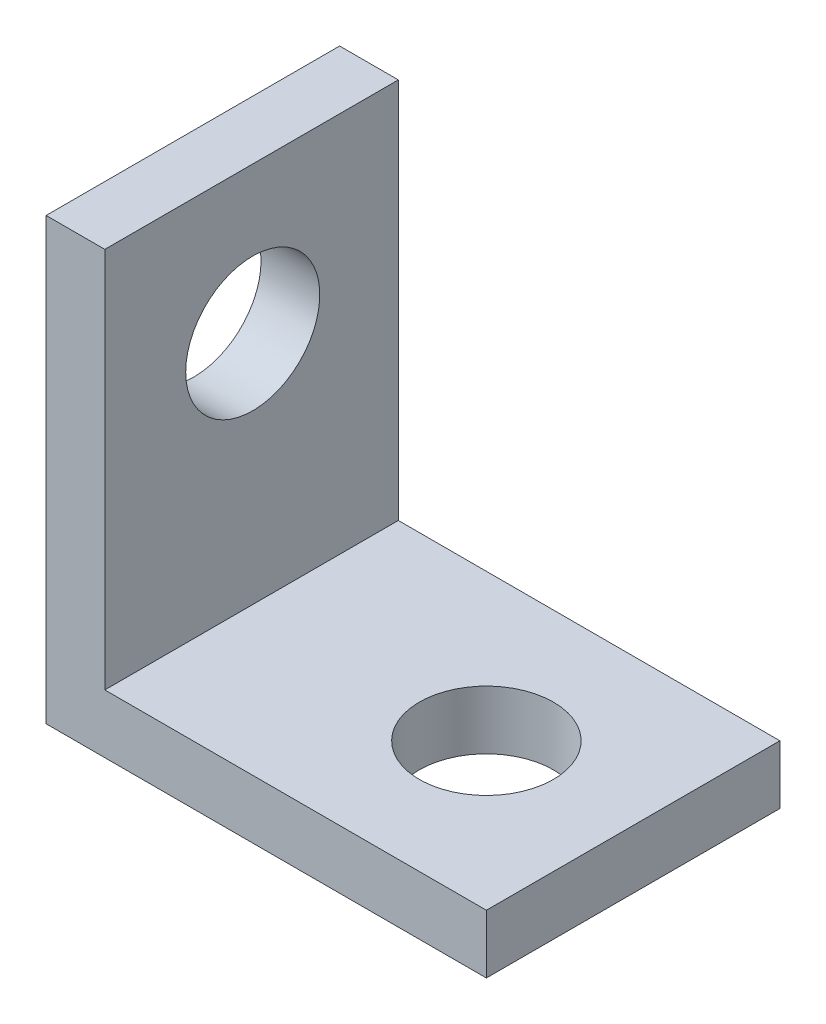
ISO-10303-21;
HEADER;
FILE_DESCRIPTION(('STEP AP214'),'2;1');
FILE_NAME('part.step','',(''),(''),'','','');
FILE_SCHEMA(('AUTOMOTIVE_DESIGN { 1 0 10303 214 1 1 1 1 }'));
ENDSEC;
DATA;
#1=APPLICATION_CONTEXT('core data for automotive mechanical design processes');
#2=APPLICATION_PROTOCOL_DEFINITION('international standard','automotive_design',2000,#1);
#3=PRODUCT_CONTEXT('',#1,'mechanical');
#4=PRODUCT('Part','Part','',(#3));
#5=PRODUCT_RELATED_PRODUCT_CATEGORY('part','',(#4));
#6=PRODUCT_DEFINITION_FORMATION('','',#4);
#7=PRODUCT_DEFINITION_CONTEXT('part definition',#1,'design');
#8=PRODUCT_DEFINITION('design','',#6,#7);
#9=PRODUCT_DEFINITION_SHAPE('','',#8);
#10=(LENGTH_UNIT() NAMED_UNIT(*) SI_UNIT(.MILLI.,.METRE.));
#11=(NAMED_UNIT(*) PLANE_ANGLE_UNIT() SI_UNIT($,.RADIAN.));
#12=(NAMED_UNIT(*) SI_UNIT($,.STERADIAN.) SOLID_ANGLE_UNIT());
#13=UNCERTAINTY_MEASURE_WITH_UNIT(LENGTH_MEASURE(1.E-05),#10,'distance_accuracy_value','');
#14=(GEOMETRIC_REPRESENTATION_CONTEXT(3) GLOBAL_UNCERTAINTY_ASSIGNED_CONTEXT((#13)) GLOBAL_UNIT_ASSIGNED_CONTEXT((#10,
#11,#12)) REPRESENTATION_CONTEXT('',''));
#15=CARTESIAN_POINT('',(0.,0.,0.));
#16=DIRECTION('',(0.,0.,1.));
#17=DIRECTION('',(1.,0.,0.));
#18=AXIS2_PLACEMENT_3D('',#15,#16,#17);
#19=CARTESIAN_POINT('',(0.,0.,12.7));
#20=DIRECTION('',(0.,1.,0.));
#21=DIRECTION('',(0.,0.,1.));
#22=AXIS2_PLACEMENT_3D('',#19,#20,#21);
#23=PLANE('',#22);
#24=CARTESIAN_POINT('',(12.7,0.,6.35));
#25=DIRECTION('',(0.,1.,0.));
#26=DIRECTION('',(0.,0.,1.));
#27=AXIS2_PLACEMENT_3D('',#24,#25,#26);
#28=CIRCLE('',#27,2.9);
#29=CARTESIAN_POINT('',(12.7,0.,9.25));
#30=VERTEX_POINT('',#29);
#31=EDGE_CURVE('E184',#30,#30,#28,.T.);
#32=ORIENTED_EDGE('',*,*,#31,.T.);
#33=EDGE_LOOP('',(#32));
#34=FACE_BOUND('',#33,.T.);
#35=DIRECTION('',(1.,0.,0.));
#36=VECTOR('',#35,1.);
#37=CARTESIAN_POINT('',(0.,0.,0.));
#38=LINE('',#37,#36);
#39=CARTESIAN_POINT('',(0.,0.,0.));
#40=VERTEX_POINT('',#39);
#41=CARTESIAN_POINT('',(19.05,0.,0.));
#42=VERTEX_POINT('',#41);
#43=EDGE_CURVE('E129',#40,#42,#38,.T.);
#44=ORIENTED_EDGE('',*,*,#43,.T.);
#45=DIRECTION('',(0.,0.,-1.));
#46=VECTOR('',#45,1.);
#47=CARTESIAN_POINT('',(19.05,0.,12.7));
#48=LINE('',#47,#46);
#49=CARTESIAN_POINT('',(19.05,0.,12.7));
#50=VERTEX_POINT('',#49);
#51=EDGE_CURVE('E11',#50,#42,#48,.T.);
#52=ORIENTED_EDGE('',*,*,#51,.F.);
#53=DIRECTION('',(1.,0.,0.));
#54=VECTOR('',#53,1.);
#55=CARTESIAN_POINT('',(0.,0.,12.7));
#56=LINE('',#55,#54);
#57=CARTESIAN_POINT('',(0.,0.,12.7));
#58=VERTEX_POINT('',#57);
#59=EDGE_CURVE('E146',#58,#50,#56,.T.);
#60=ORIENTED_EDGE('',*,*,#59,.F.);
#61=DIRECTION('',(0.,0.,-1.));
#62=VECTOR('',#61,1.);
#63=CARTESIAN_POINT('',(0.,0.,12.7));
#64=LINE('',#63,#62);
#65=EDGE_CURVE('E125',#58,#40,#64,.T.);
#66=ORIENTED_EDGE('',*,*,#65,.T.);
#67=EDGE_LOOP('',(#44,#52,#60,#66));
#68=FACE_BOUND('',#67,.T.);
#69=ADVANCED_FACE('F39',(#34,#68),#23,.F.);
#70=CARTESIAN_POINT('',(19.05,0.,12.7));
#71=DIRECTION('',(-1.,0.,0.));
#72=DIRECTION('',(0.,0.,1.));
#73=AXIS2_PLACEMENT_3D('',#70,#71,#72);
#74=PLANE('',#73);
#75=DIRECTION('',(0.,1.,0.));
#76=VECTOR('',#75,1.);
#77=CARTESIAN_POINT('',(19.05,0.,0.));
#78=LINE('',#77,#76);
#79=CARTESIAN_POINT('',(19.05,2.54,0.));
#80=VERTEX_POINT('',#79);
#81=EDGE_CURVE('E133',#42,#80,#78,.T.);
#82=ORIENTED_EDGE('',*,*,#81,.T.);
#83=DIRECTION('',(0.,0.,-1.));
#84=VECTOR('',#83,1.);
#85=CARTESIAN_POINT('',(19.05,2.54,12.7));
#86=LINE('',#85,#84);
#87=CARTESIAN_POINT('',(19.05,2.54,12.7));
#88=VERTEX_POINT('',#87);
#89=EDGE_CURVE('E49',#88,#80,#86,.T.);
#90=ORIENTED_EDGE('',*,*,#89,.F.);
#91=DIRECTION('',(0.,1.,0.));
#92=VECTOR('',#91,1.);
#93=CARTESIAN_POINT('',(19.05,0.,12.7));
#94=LINE('',#93,#92);
#95=EDGE_CURVE('E94',#50,#88,#94,.T.);
#96=ORIENTED_EDGE('',*,*,#95,.F.);
#97=ORIENTED_EDGE('',*,*,#51,.T.);
#98=EDGE_LOOP('',(#82,#90,#96,#97));
#99=FACE_BOUND('',#98,.T.);
#100=ADVANCED_FACE('F177',(#99),#74,.F.);
#101=CARTESIAN_POINT('',(2.54,2.54,12.7));
#102=DIRECTION('',(0.,-1.,0.));
#103=DIRECTION('',(0.,0.,-1.));
#104=AXIS2_PLACEMENT_3D('',#101,#102,#103);
#105=PLANE('',#104);
#106=CARTESIAN_POINT('',(12.7,2.54,6.35));
#107=DIRECTION('',(0.,-1.,0.));
#108=DIRECTION('',(0.,0.,-1.));
#109=AXIS2_PLACEMENT_3D('',#106,#107,#108);
#110=CIRCLE('',#109,2.9);
#111=CARTESIAN_POINT('',(12.7,2.54,3.45));
#112=VERTEX_POINT('',#111);
#113=EDGE_CURVE('E42',#112,#112,#110,.F.);
#114=ORIENTED_EDGE('',*,*,#113,.F.);
#115=EDGE_LOOP('',(#114));
#116=FACE_BOUND('',#115,.T.);
#117=DIRECTION('',(-1.,0.,0.));
#118=VECTOR('',#117,1.);
#119=CARTESIAN_POINT('',(2.54,2.54,0.));
#120=LINE('',#119,#118);
#121=CARTESIAN_POINT('',(2.54,2.54,0.));
#122=VERTEX_POINT('',#121);
#123=EDGE_CURVE('E137',#80,#122,#120,.T.);
#124=ORIENTED_EDGE('',*,*,#123,.T.);
#125=DIRECTION('',(0.,0.,-1.));
#126=VECTOR('',#125,1.);
#127=CARTESIAN_POINT('',(2.54,2.54,12.7));
#128=LINE('',#127,#126);
#129=CARTESIAN_POINT('',(2.54,2.54,12.7));
#130=VERTEX_POINT('',#129);
#131=EDGE_CURVE('E118',#130,#122,#128,.T.);
#132=ORIENTED_EDGE('',*,*,#131,.F.);
#133=DIRECTION('',(-1.,0.,0.));
#134=VECTOR('',#133,1.);
#135=CARTESIAN_POINT('',(2.54,2.54,12.7));
#136=LINE('',#135,#134);
#137=EDGE_CURVE('E107',#88,#130,#136,.T.);
#138=ORIENTED_EDGE('',*,*,#137,.F.);
#139=ORIENTED_EDGE('',*,*,#89,.T.);
#140=EDGE_LOOP('',(#124,#132,#138,#139));
#141=FACE_BOUND('',#140,.T.);
#142=ADVANCED_FACE('F157',(#116,#141),#105,.F.);
#143=CARTESIAN_POINT('',(2.54,2.54,12.7));
#144=DIRECTION('',(-1.,0.,0.));
#145=DIRECTION('',(0.,0.,1.));
#146=AXIS2_PLACEMENT_3D('',#143,#144,#145);
#147=PLANE('',#146);
#148=CARTESIAN_POINT('',(2.54,12.7,6.29990998680423));
#149=DIRECTION('',(-1.,0.,0.));
#150=DIRECTION('',(0.,0.,1.));
#151=AXIS2_PLACEMENT_3D('',#148,#149,#150);
#152=CIRCLE('',#151,2.9);
#153=CARTESIAN_POINT('',(2.54,12.7,9.19990998680422));
#154=VERTEX_POINT('',#153);
#155=EDGE_CURVE('E134',#154,#154,#152,.F.);
#156=ORIENTED_EDGE('',*,*,#155,.F.);
#157=EDGE_LOOP('',(#156));
#158=FACE_BOUND('',#157,.T.);
#159=DIRECTION('',(0.,1.,0.));
#160=VECTOR('',#159,1.);
#161=CARTESIAN_POINT('',(2.54,2.54,0.));
#162=LINE('',#161,#160);
#163=CARTESIAN_POINT('',(2.54,19.05,0.));
#164=VERTEX_POINT('',#163);
#165=EDGE_CURVE('E116',#122,#164,#162,.T.);
#166=ORIENTED_EDGE('',*,*,#165,.T.);
#167=DIRECTION('',(0.,0.,-1.));
#168=VECTOR('',#167,1.);
#169=CARTESIAN_POINT('',(2.54,19.05,12.7));
#170=LINE('',#169,#168);
#171=CARTESIAN_POINT('',(2.54,19.05,12.7));
#172=VERTEX_POINT('',#171);
#173=EDGE_CURVE('E113',#172,#164,#170,.T.);
#174=ORIENTED_EDGE('',*,*,#173,.F.);
#175=DIRECTION('',(0.,1.,0.));
#176=VECTOR('',#175,1.);
#177=CARTESIAN_POINT('',(2.54,2.54,12.7));
#178=LINE('',#177,#176);
#179=EDGE_CURVE('E101',#130,#172,#178,.T.);
#180=ORIENTED_EDGE('',*,*,#179,.F.);
#181=ORIENTED_EDGE('',*,*,#131,.T.);
#182=EDGE_LOOP('',(#166,#174,#180,#181));
#183=FACE_BOUND('',#182,.T.);
#184=ADVANCED_FACE('F114',(#158,#183),#147,.F.);
#185=CARTESIAN_POINT('',(0.,19.05,12.7));
#186=DIRECTION('',(0.,-1.,0.));
#187=DIRECTION('',(0.,0.,-1.));
#188=AXIS2_PLACEMENT_3D('',#185,#186,#187);
#189=PLANE('',#188);
#190=DIRECTION('',(-1.,0.,0.));
#191=VECTOR('',#190,1.);
#192=CARTESIAN_POINT('',(0.,19.05,0.));
#193=LINE('',#192,#191);
#194=CARTESIAN_POINT('',(0.,19.05,0.));
#195=VERTEX_POINT('',#194);
#196=EDGE_CURVE('E80',#164,#195,#193,.T.);
#197=ORIENTED_EDGE('',*,*,#196,.T.);
#198=DIRECTION('',(0.,0.,-1.));
#199=VECTOR('',#198,1.);
#200=CARTESIAN_POINT('',(0.,19.05,12.7));
#201=LINE('',#200,#199);
#202=CARTESIAN_POINT('',(0.,19.05,12.7));
#203=VERTEX_POINT('',#202);
#204=EDGE_CURVE('E119',#203,#195,#201,.T.);
#205=ORIENTED_EDGE('',*,*,#204,.F.);
#206=DIRECTION('',(-1.,0.,0.));
#207=VECTOR('',#206,1.);
#208=CARTESIAN_POINT('',(0.,19.05,12.7));
#209=LINE('',#208,#207);
#210=EDGE_CURVE('E105',#172,#203,#209,.T.);
#211=ORIENTED_EDGE('',*,*,#210,.F.);
#212=ORIENTED_EDGE('',*,*,#173,.T.);
#213=EDGE_LOOP('',(#197,#205,#211,#212));
#214=FACE_BOUND('',#213,.T.);
#215=ADVANCED_FACE('F121',(#214),#189,.F.);
#216=CARTESIAN_POINT('',(0.,0.,12.7));
#217=DIRECTION('',(1.,0.,0.));
#218=DIRECTION('',(0.,0.,-1.));
#219=AXIS2_PLACEMENT_3D('',#216,#217,#218);
#220=PLANE('',#219);
#221=CARTESIAN_POINT('',(0.,12.7,6.29990998680423));
#222=DIRECTION('',(1.,0.,0.));
#223=DIRECTION('',(0.,0.,-1.));
#224=AXIS2_PLACEMENT_3D('',#221,#222,#223);
#225=CIRCLE('',#224,2.9);
#226=CARTESIAN_POINT('',(0.,12.7,3.39990998680423));
#227=VERTEX_POINT('',#226);
#228=EDGE_CURVE('E190',#227,#227,#225,.T.);
#229=ORIENTED_EDGE('',*,*,#228,.T.);
#230=EDGE_LOOP('',(#229));
#231=FACE_BOUND('',#230,.T.);
#232=DIRECTION('',(0.,-1.,0.));
#233=VECTOR('',#232,1.);
#234=CARTESIAN_POINT('',(0.,0.,0.));
#235=LINE('',#234,#233);
#236=EDGE_CURVE('E86',#195,#40,#235,.T.);
#237=ORIENTED_EDGE('',*,*,#236,.T.);
#238=ORIENTED_EDGE('',*,*,#65,.F.);
#239=DIRECTION('',(0.,-1.,0.));
#240=VECTOR('',#239,1.);
#241=CARTESIAN_POINT('',(0.,0.,12.7));
#242=LINE('',#241,#240);
#243=EDGE_CURVE('E57',#203,#58,#242,.T.);
#244=ORIENTED_EDGE('',*,*,#243,.F.);
#245=ORIENTED_EDGE('',*,*,#204,.T.);
#246=EDGE_LOOP('',(#237,#238,#244,#245));
#247=FACE_BOUND('',#246,.T.);
#248=ADVANCED_FACE('F164',(#231,#247),#220,.F.);
#249=CARTESIAN_POINT('',(0.,0.,12.7));
#250=DIRECTION('',(0.,0.,1.));
#251=DIRECTION('',(1.,0.,0.));
#252=AXIS2_PLACEMENT_3D('',#249,#250,#251);
#253=PLANE('',#252);
#254=ORIENTED_EDGE('',*,*,#59,.T.);
#255=ORIENTED_EDGE('',*,*,#95,.T.);
#256=ORIENTED_EDGE('',*,*,#137,.T.);
#257=ORIENTED_EDGE('',*,*,#179,.T.);
#258=ORIENTED_EDGE('',*,*,#210,.T.);
#259=ORIENTED_EDGE('',*,*,#243,.T.);
#260=EDGE_LOOP('',(#254,#255,#256,#257,#258,#259));
#261=FACE_BOUND('',#260,.T.);
#262=ADVANCED_FACE('F103',(#261),#253,.T.);
#263=CARTESIAN_POINT('',(0.,0.,0.));
#264=DIRECTION('',(0.,0.,1.));
#265=DIRECTION('',(1.,0.,0.));
#266=AXIS2_PLACEMENT_3D('',#263,#264,#265);
#267=PLANE('',#266);
#268=ORIENTED_EDGE('',*,*,#43,.F.);
#269=ORIENTED_EDGE('',*,*,#236,.F.);
#270=ORIENTED_EDGE('',*,*,#196,.F.);
#271=ORIENTED_EDGE('',*,*,#165,.F.);
#272=ORIENTED_EDGE('',*,*,#123,.F.);
#273=ORIENTED_EDGE('',*,*,#81,.F.);
#274=EDGE_LOOP('',(#268,#269,#270,#271,#272,#273));
#275=FACE_BOUND('',#274,.T.);
#276=ADVANCED_FACE('F160',(#275),#267,.F.);
#277=CARTESIAN_POINT('',(12.7,12.7,6.29990998680423));
#278=DIRECTION('',(-1.,0.,0.));
#279=DIRECTION('',(0.,0.,1.));
#280=AXIS2_PLACEMENT_3D('',#277,#278,#279);
#281=CYLINDRICAL_SURFACE('',#280,2.9);
#282=ORIENTED_EDGE('',*,*,#228,.F.);
#283=EDGE_LOOP('',(#282));
#284=FACE_BOUND('',#283,.T.);
#285=ORIENTED_EDGE('',*,*,#155,.T.);
#286=EDGE_LOOP('',(#285));
#287=FACE_BOUND('',#286,.T.);
#288=ADVANCED_FACE('F203',(#284,#287),#281,.F.);
#289=CARTESIAN_POINT('',(12.7,12.7,6.35));
#290=DIRECTION('',(0.,-1.,0.));
#291=DIRECTION('',(0.,0.,-1.));
#292=AXIS2_PLACEMENT_3D('',#289,#290,#291);
#293=CYLINDRICAL_SURFACE('',#292,2.9);
#294=ORIENTED_EDGE('',*,*,#31,.F.);
#295=EDGE_LOOP('',(#294));
#296=FACE_BOUND('',#295,.T.);
#297=ORIENTED_EDGE('',*,*,#113,.T.);
#298=EDGE_LOOP('',(#297));
#299=FACE_BOUND('',#298,.T.);
#300=ADVANCED_FACE('F216',(#296,#299),#293,.F.);
#301=CLOSED_SHELL('',(#69,#100,#142,#184,#215,#248,#262,#276,#288,#300));
#302=MANIFOLD_SOLID_BREP('B2',#301);
#303=ADVANCED_BREP_SHAPE_REPRESENTATION('',(#18,#302),#14);
#304=SHAPE_DEFINITION_REPRESENTATION(#9,#303);
ENDSEC;
END-ISO-10303-21;
